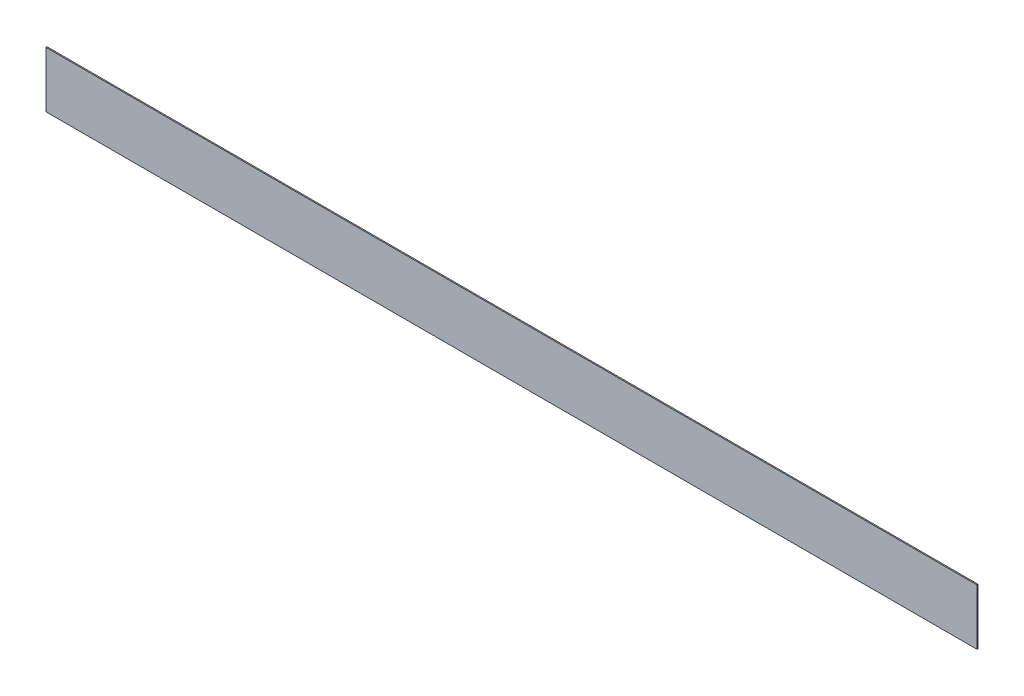
ISO-10303-21;
HEADER;
FILE_DESCRIPTION(('STEP AP214'),'2;1');
FILE_NAME('part.step','',(''),(''),'','','');
FILE_SCHEMA(('AUTOMOTIVE_DESIGN { 1 0 10303 214 1 1 1 1 }'));
ENDSEC;
DATA;
#1=APPLICATION_CONTEXT('core data for automotive mechanical design processes');
#2=APPLICATION_PROTOCOL_DEFINITION('international standard','automotive_design',2000,#1);
#3=PRODUCT_CONTEXT('',#1,'mechanical');
#4=PRODUCT('Part','Part','',(#3));
#5=PRODUCT_RELATED_PRODUCT_CATEGORY('part','',(#4));
#6=PRODUCT_DEFINITION_FORMATION('','',#4);
#7=PRODUCT_DEFINITION_CONTEXT('part definition',#1,'design');
#8=PRODUCT_DEFINITION('design','',#6,#7);
#9=PRODUCT_DEFINITION_SHAPE('','',#8);
#10=(LENGTH_UNIT() NAMED_UNIT(*) SI_UNIT(.MILLI.,.METRE.));
#11=(NAMED_UNIT(*) PLANE_ANGLE_UNIT() SI_UNIT($,.RADIAN.));
#12=(NAMED_UNIT(*) SI_UNIT($,.STERADIAN.) SOLID_ANGLE_UNIT());
#13=UNCERTAINTY_MEASURE_WITH_UNIT(LENGTH_MEASURE(1.E-05),#10,'distance_accuracy_value','');
#14=(GEOMETRIC_REPRESENTATION_CONTEXT(3) GLOBAL_UNCERTAINTY_ASSIGNED_CONTEXT((#13)) GLOBAL_UNIT_ASSIGNED_CONTEXT((#10,
#11,#12)) REPRESENTATION_CONTEXT('',''));
#15=CARTESIAN_POINT('',(0.,0.,0.));
#16=DIRECTION('',(0.,0.,1.));
#17=DIRECTION('',(1.,0.,0.));
#18=AXIS2_PLACEMENT_3D('',#15,#16,#17);
#19=CARTESIAN_POINT('',(66.,690.,40.));
#20=DIRECTION('',(1.,0.,0.));
#21=DIRECTION('',(0.,0.,-1.));
#22=AXIS2_PLACEMENT_3D('',#19,#20,#21);
#23=PLANE('',#22);
#24=DIRECTION('',(0.,-1.,0.));
#25=VECTOR('',#24,1.);
#26=CARTESIAN_POINT('',(66.,690.,38.5));
#27=LINE('',#26,#25);
#28=CARTESIAN_POINT('',(66.,766.,38.5));
#29=VERTEX_POINT('',#28);
#30=CARTESIAN_POINT('',(66.,690.,38.5));
#31=VERTEX_POINT('',#30);
#32=EDGE_CURVE('E102',#29,#31,#27,.T.);
#33=ORIENTED_EDGE('',*,*,#32,.T.);
#34=DIRECTION('',(0.,0.,-1.));
#35=VECTOR('',#34,1.);
#36=CARTESIAN_POINT('',(66.,690.,40.));
#37=LINE('',#36,#35);
#38=CARTESIAN_POINT('',(66.,690.,40.));
#39=VERTEX_POINT('',#38);
#40=EDGE_CURVE('E11',#39,#31,#37,.T.);
#41=ORIENTED_EDGE('',*,*,#40,.F.);
#42=DIRECTION('',(0.,-1.,0.));
#43=VECTOR('',#42,1.);
#44=CARTESIAN_POINT('',(66.,690.,40.));
#45=LINE('',#44,#43);
#46=CARTESIAN_POINT('',(66.,766.,40.));
#47=VERTEX_POINT('',#46);
#48=EDGE_CURVE('E90',#47,#39,#45,.T.);
#49=ORIENTED_EDGE('',*,*,#48,.F.);
#50=DIRECTION('',(0.,0.,-1.));
#51=VECTOR('',#50,1.);
#52=CARTESIAN_POINT('',(66.,766.,40.));
#53=LINE('',#52,#51);
#54=EDGE_CURVE('E98',#47,#29,#53,.T.);
#55=ORIENTED_EDGE('',*,*,#54,.T.);
#56=EDGE_LOOP('',(#33,#41,#49,#55));
#57=FACE_BOUND('',#56,.T.);
#58=ADVANCED_FACE('F39',(#57),#23,.F.);
#59=CARTESIAN_POINT('',(66.,690.,40.));
#60=DIRECTION('',(0.,1.,0.));
#61=DIRECTION('',(0.,0.,1.));
#62=AXIS2_PLACEMENT_3D('',#59,#60,#61);
#63=PLANE('',#62);
#64=DIRECTION('',(1.,0.,0.));
#65=VECTOR('',#64,1.);
#66=CARTESIAN_POINT('',(66.,690.,38.5));
#67=LINE('',#66,#65);
#68=CARTESIAN_POINT('',(1334.,690.,38.5));
#69=VERTEX_POINT('',#68);
#70=EDGE_CURVE('E94',#31,#69,#67,.T.);
#71=ORIENTED_EDGE('',*,*,#70,.T.);
#72=DIRECTION('',(0.,0.,-1.));
#73=VECTOR('',#72,1.);
#74=CARTESIAN_POINT('',(1334.,690.,40.));
#75=LINE('',#74,#73);
#76=CARTESIAN_POINT('',(1334.,690.,40.));
#77=VERTEX_POINT('',#76);
#78=EDGE_CURVE('E47',#77,#69,#75,.T.);
#79=ORIENTED_EDGE('',*,*,#78,.F.);
#80=DIRECTION('',(1.,0.,0.));
#81=VECTOR('',#80,1.);
#82=CARTESIAN_POINT('',(66.,690.,40.));
#83=LINE('',#82,#81);
#84=EDGE_CURVE('E85',#39,#77,#83,.T.);
#85=ORIENTED_EDGE('',*,*,#84,.F.);
#86=ORIENTED_EDGE('',*,*,#40,.T.);
#87=EDGE_LOOP('',(#71,#79,#85,#86));
#88=FACE_BOUND('',#87,.T.);
#89=ADVANCED_FACE('F93',(#88),#63,.F.);
#90=CARTESIAN_POINT('',(1334.,690.,40.));
#91=DIRECTION('',(-1.,0.,0.));
#92=DIRECTION('',(0.,0.,1.));
#93=AXIS2_PLACEMENT_3D('',#90,#91,#92);
#94=PLANE('',#93);
#95=DIRECTION('',(0.,1.,0.));
#96=VECTOR('',#95,1.);
#97=CARTESIAN_POINT('',(1334.,690.,38.5));
#98=LINE('',#97,#96);
#99=CARTESIAN_POINT('',(1334.,766.,38.5));
#100=VERTEX_POINT('',#99);
#101=EDGE_CURVE('E72',#69,#100,#98,.T.);
#102=ORIENTED_EDGE('',*,*,#101,.T.);
#103=DIRECTION('',(0.,0.,-1.));
#104=VECTOR('',#103,1.);
#105=CARTESIAN_POINT('',(1334.,766.,40.));
#106=LINE('',#105,#104);
#107=CARTESIAN_POINT('',(1334.,766.,40.));
#108=VERTEX_POINT('',#107);
#109=EDGE_CURVE('E95',#108,#100,#106,.T.);
#110=ORIENTED_EDGE('',*,*,#109,.F.);
#111=DIRECTION('',(0.,1.,0.));
#112=VECTOR('',#111,1.);
#113=CARTESIAN_POINT('',(1334.,690.,40.));
#114=LINE('',#113,#112);
#115=EDGE_CURVE('E88',#77,#108,#114,.T.);
#116=ORIENTED_EDGE('',*,*,#115,.F.);
#117=ORIENTED_EDGE('',*,*,#78,.T.);
#118=EDGE_LOOP('',(#102,#110,#116,#117));
#119=FACE_BOUND('',#118,.T.);
#120=ADVANCED_FACE('F96',(#119),#94,.F.);
#121=CARTESIAN_POINT('',(66.,766.,40.));
#122=DIRECTION('',(0.,-1.,0.));
#123=DIRECTION('',(0.,0.,-1.));
#124=AXIS2_PLACEMENT_3D('',#121,#122,#123);
#125=PLANE('',#124);
#126=DIRECTION('',(-1.,0.,0.));
#127=VECTOR('',#126,1.);
#128=CARTESIAN_POINT('',(66.,766.,38.5));
#129=LINE('',#128,#127);
#130=EDGE_CURVE('E78',#100,#29,#129,.T.);
#131=ORIENTED_EDGE('',*,*,#130,.T.);
#132=ORIENTED_EDGE('',*,*,#54,.F.);
#133=DIRECTION('',(-1.,0.,0.));
#134=VECTOR('',#133,1.);
#135=CARTESIAN_POINT('',(66.,766.,40.));
#136=LINE('',#135,#134);
#137=EDGE_CURVE('E55',#108,#47,#136,.T.);
#138=ORIENTED_EDGE('',*,*,#137,.F.);
#139=ORIENTED_EDGE('',*,*,#109,.T.);
#140=EDGE_LOOP('',(#131,#132,#138,#139));
#141=FACE_BOUND('',#140,.T.);
#142=ADVANCED_FACE('F109',(#141),#125,.F.);
#143=CARTESIAN_POINT('',(0.,0.,40.));
#144=DIRECTION('',(0.,0.,-1.));
#145=DIRECTION('',(-1.,0.,0.));
#146=AXIS2_PLACEMENT_3D('',#143,#144,#145);
#147=PLANE('',#146);
#148=ORIENTED_EDGE('',*,*,#48,.T.);
#149=ORIENTED_EDGE('',*,*,#84,.T.);
#150=ORIENTED_EDGE('',*,*,#115,.T.);
#151=ORIENTED_EDGE('',*,*,#137,.T.);
#152=EDGE_LOOP('',(#148,#149,#150,#151));
#153=FACE_BOUND('',#152,.T.);
#154=ADVANCED_FACE('F86',(#153),#147,.F.);
#155=CARTESIAN_POINT('',(0.,0.,38.5));
#156=DIRECTION('',(0.,0.,-1.));
#157=DIRECTION('',(-1.,0.,0.));
#158=AXIS2_PLACEMENT_3D('',#155,#156,#157);
#159=PLANE('',#158);
#160=ORIENTED_EDGE('',*,*,#32,.F.);
#161=ORIENTED_EDGE('',*,*,#130,.F.);
#162=ORIENTED_EDGE('',*,*,#101,.F.);
#163=ORIENTED_EDGE('',*,*,#70,.F.);
#164=EDGE_LOOP('',(#160,#161,#162,#163));
#165=FACE_BOUND('',#164,.T.);
#166=ADVANCED_FACE('F112',(#165),#159,.T.);
#167=CLOSED_SHELL('',(#58,#89,#120,#142,#154,#166));
#168=MANIFOLD_SOLID_BREP('B2',#167);
#169=ADVANCED_BREP_SHAPE_REPRESENTATION('',(#18,#168),#14);
#170=SHAPE_DEFINITION_REPRESENTATION(#9,#169);
ENDSEC;
END-ISO-10303-21;
